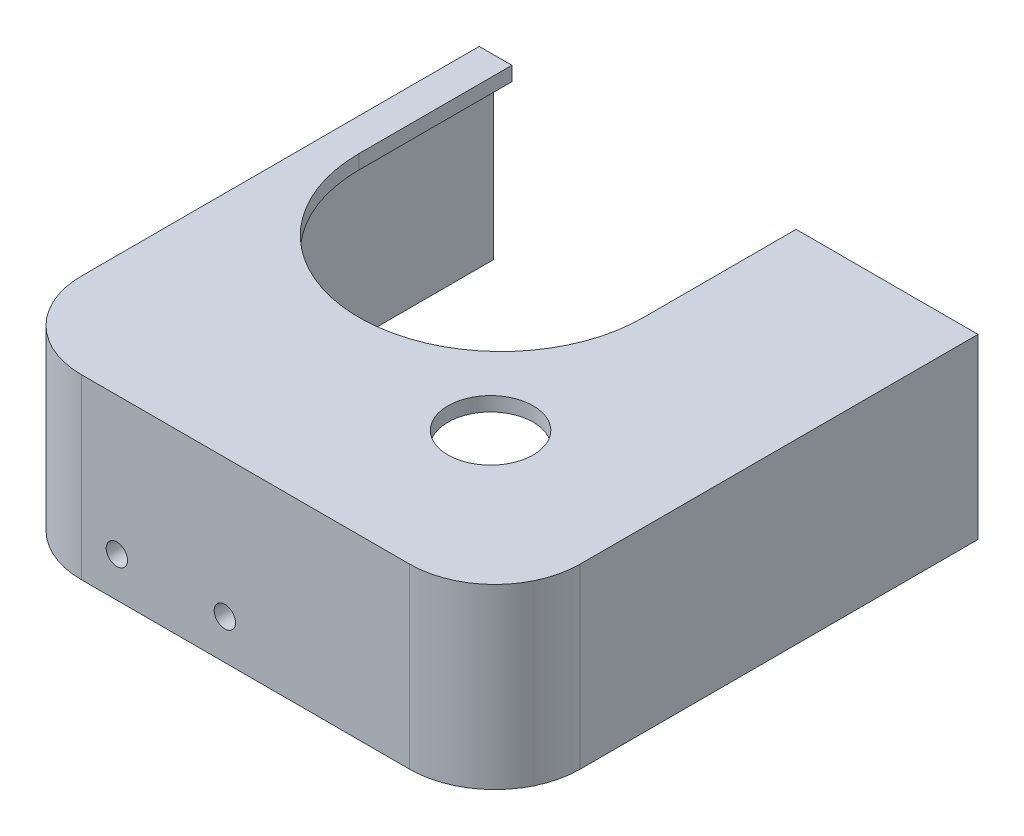
ISO-10303-21;
HEADER;
FILE_DESCRIPTION(('STEP AP214'),'2;1');
FILE_NAME('part.step','',(''),(''),'','','');
FILE_SCHEMA(('AUTOMOTIVE_DESIGN { 1 0 10303 214 1 1 1 1 }'));
ENDSEC;
DATA;
#1=APPLICATION_CONTEXT('core data for automotive mechanical design processes');
#2=APPLICATION_PROTOCOL_DEFINITION('international standard','automotive_design',2000,#1);
#3=PRODUCT_CONTEXT('',#1,'mechanical');
#4=PRODUCT('Part','Part','',(#3));
#5=PRODUCT_RELATED_PRODUCT_CATEGORY('part','',(#4));
#6=PRODUCT_DEFINITION_FORMATION('','',#4);
#7=PRODUCT_DEFINITION_CONTEXT('part definition',#1,'design');
#8=PRODUCT_DEFINITION('design','',#6,#7);
#9=PRODUCT_DEFINITION_SHAPE('','',#8);
#10=(LENGTH_UNIT() NAMED_UNIT(*) SI_UNIT(.MILLI.,.METRE.));
#11=(NAMED_UNIT(*) PLANE_ANGLE_UNIT() SI_UNIT($,.RADIAN.));
#12=(NAMED_UNIT(*) SI_UNIT($,.STERADIAN.) SOLID_ANGLE_UNIT());
#13=UNCERTAINTY_MEASURE_WITH_UNIT(LENGTH_MEASURE(1.E-05),#10,'distance_accuracy_value','');
#14=(GEOMETRIC_REPRESENTATION_CONTEXT(3) GLOBAL_UNCERTAINTY_ASSIGNED_CONTEXT((#13)) GLOBAL_UNIT_ASSIGNED_CONTEXT((#10,
#11,#12)) REPRESENTATION_CONTEXT('',''));
#15=CARTESIAN_POINT('',(0.,0.,0.));
#16=DIRECTION('',(0.,0.,1.));
#17=DIRECTION('',(1.,0.,0.));
#18=AXIS2_PLACEMENT_3D('',#15,#16,#17);
#19=CARTESIAN_POINT('',(-1.5,-13.4999999999995,-21.75));
#20=DIRECTION('',(-1.,0.,0.));
#21=DIRECTION('',(0.,0.,1.));
#22=AXIS2_PLACEMENT_3D('',#19,#20,#21);
#23=PLANE('',#22);
#24=DIRECTION('',(0.,-1.,0.));
#25=VECTOR('',#24,1.);
#26=CARTESIAN_POINT('',(-1.5,-13.4999999999995,-32.5));
#27=LINE('',#26,#25);
#28=CARTESIAN_POINT('',(-1.5,-12.4999999999995,-32.5));
#29=VERTEX_POINT('',#28);
#30=CARTESIAN_POINT('',(-1.5,-13.4999999999995,-32.5));
#31=VERTEX_POINT('',#30);
#32=EDGE_CURVE('E392',#29,#31,#27,.T.);
#33=ORIENTED_EDGE('',*,*,#32,.T.);
#34=DIRECTION('',(0.,0.,-1.));
#35=VECTOR('',#34,1.);
#36=CARTESIAN_POINT('',(-1.5,-13.4999999999995,-21.75));
#37=LINE('',#36,#35);
#38=CARTESIAN_POINT('',(-1.5,-13.4999999999995,-21.75));
#39=VERTEX_POINT('',#38);
#40=EDGE_CURVE('E234',#39,#31,#37,.T.);
#41=ORIENTED_EDGE('',*,*,#40,.F.);
#42=DIRECTION('',(0.,-1.,0.));
#43=VECTOR('',#42,1.);
#44=CARTESIAN_POINT('',(-1.5,-13.4999999999995,-21.75));
#45=LINE('',#44,#43);
#46=CARTESIAN_POINT('',(-1.5,-12.4999999999995,-21.75));
#47=VERTEX_POINT('',#46);
#48=EDGE_CURVE('E395',#47,#39,#45,.T.);
#49=ORIENTED_EDGE('',*,*,#48,.F.);
#50=DIRECTION('',(0.,0.,-1.));
#51=VECTOR('',#50,1.);
#52=CARTESIAN_POINT('',(-1.5,-12.4999999999995,-21.75));
#53=LINE('',#52,#51);
#54=EDGE_CURVE('E298',#47,#29,#53,.T.);
#55=ORIENTED_EDGE('',*,*,#54,.T.);
#56=EDGE_LOOP('',(#33,#41,#49,#55));
#57=FACE_BOUND('',#56,.T.);
#58=ADVANCED_FACE('F38',(#57),#23,.T.);
#59=CARTESIAN_POINT('',(-11.5,-13.4999999999995,-21.75));
#60=DIRECTION('',(0.,-1.,0.));
#61=DIRECTION('',(0.,0.,-1.));
#62=AXIS2_PLACEMENT_3D('',#59,#60,#61);
#63=CYLINDRICAL_SURFACE('',#62,10.);
#64=ORIENTED_EDGE('',*,*,#48,.T.);
#65=CARTESIAN_POINT('',(-11.5,-13.4999999999995,-21.75));
#66=DIRECTION('',(0.,1.,0.));
#67=DIRECTION('',(0.,0.,-1.));
#68=AXIS2_PLACEMENT_3D('',#65,#66,#67);
#69=CIRCLE('',#68,10.);
#70=CARTESIAN_POINT('',(-21.5,-13.4999999999995,-21.75));
#71=VERTEX_POINT('',#70);
#72=EDGE_CURVE('E232',#71,#39,#69,.T.);
#73=ORIENTED_EDGE('',*,*,#72,.F.);
#74=DIRECTION('',(0.,-1.,0.));
#75=VECTOR('',#74,1.);
#76=CARTESIAN_POINT('',(-21.5,-13.4999999999995,-21.75));
#77=LINE('',#76,#75);
#78=CARTESIAN_POINT('',(-21.5,-12.4999999999995,-21.75));
#79=VERTEX_POINT('',#78);
#80=EDGE_CURVE('E398',#79,#71,#77,.T.);
#81=ORIENTED_EDGE('',*,*,#80,.F.);
#82=CARTESIAN_POINT('',(-11.5,-12.4999999999995,-21.75));
#83=DIRECTION('',(0.,1.,0.));
#84=DIRECTION('',(0.,0.,-1.));
#85=AXIS2_PLACEMENT_3D('',#82,#83,#84);
#86=CIRCLE('',#85,10.);
#87=EDGE_CURVE('E295',#79,#47,#86,.T.);
#88=ORIENTED_EDGE('',*,*,#87,.T.);
#89=EDGE_LOOP('',(#64,#73,#81,#88));
#90=FACE_BOUND('',#89,.T.);
#91=ADVANCED_FACE('F433',(#90),#63,.F.);
#92=CARTESIAN_POINT('',(-21.5,-13.4999999999995,-21.75));
#93=DIRECTION('',(1.,0.,0.));
#94=DIRECTION('',(0.,0.,-1.));
#95=AXIS2_PLACEMENT_3D('',#92,#93,#94);
#96=PLANE('',#95);
#97=ORIENTED_EDGE('',*,*,#80,.T.);
#98=DIRECTION('',(0.,0.,1.));
#99=VECTOR('',#98,1.);
#100=CARTESIAN_POINT('',(-21.5,-13.4999999999995,-32.5));
#101=LINE('',#100,#99);
#102=CARTESIAN_POINT('',(-21.5,-13.4999999999995,-32.5));
#103=VERTEX_POINT('',#102);
#104=EDGE_CURVE('E230',#103,#71,#101,.T.);
#105=ORIENTED_EDGE('',*,*,#104,.F.);
#106=DIRECTION('',(0.,-1.,0.));
#107=VECTOR('',#106,1.);
#108=CARTESIAN_POINT('',(-21.5,-13.4999999999995,-32.5));
#109=LINE('',#108,#107);
#110=CARTESIAN_POINT('',(-21.5,-12.4999999999995,-32.5));
#111=VERTEX_POINT('',#110);
#112=EDGE_CURVE('E388',#111,#103,#109,.T.);
#113=ORIENTED_EDGE('',*,*,#112,.F.);
#114=DIRECTION('',(0.,0.,1.));
#115=VECTOR('',#114,1.);
#116=CARTESIAN_POINT('',(-21.5,-12.4999999999995,-21.75));
#117=LINE('',#116,#115);
#118=EDGE_CURVE('E292',#111,#79,#117,.T.);
#119=ORIENTED_EDGE('',*,*,#118,.T.);
#120=EDGE_LOOP('',(#97,#105,#113,#119));
#121=FACE_BOUND('',#120,.T.);
#122=ADVANCED_FACE('F436',(#121),#96,.T.);
#123=CARTESIAN_POINT('',(0.,-15.4999999999995,-9.49999999999997));
#124=DIRECTION('',(0.,1.,0.));
#125=DIRECTION('',(0.,0.,1.));
#126=AXIS2_PLACEMENT_3D('',#123,#124,#125);
#127=CYLINDRICAL_SURFACE('',#126,3.);
#128=CARTESIAN_POINT('',(0.,-12.4999999999995,-9.49999999999997));
#129=DIRECTION('',(0.,-1.,0.));
#130=DIRECTION('',(0.,0.,-1.));
#131=AXIS2_PLACEMENT_3D('',#128,#129,#130);
#132=CIRCLE('',#131,3.);
#133=CARTESIAN_POINT('',(0.,-12.4999999999995,-12.5));
#134=VERTEX_POINT('',#133);
#135=EDGE_CURVE('E256',#134,#134,#132,.T.);
#136=ORIENTED_EDGE('',*,*,#135,.F.);
#137=EDGE_LOOP('',(#136));
#138=FACE_BOUND('',#137,.T.);
#139=CARTESIAN_POINT('',(0.,-13.4999999999995,-9.49999999999997));
#140=DIRECTION('',(0.,-1.,0.));
#141=DIRECTION('',(0.,0.,-1.));
#142=AXIS2_PLACEMENT_3D('',#139,#140,#141);
#143=CIRCLE('',#142,3.);
#144=CARTESIAN_POINT('',(0.,-13.4999999999995,-12.5));
#145=VERTEX_POINT('',#144);
#146=EDGE_CURVE('E42',#145,#145,#143,.F.);
#147=ORIENTED_EDGE('',*,*,#146,.F.);
#148=EDGE_LOOP('',(#147));
#149=FACE_BOUND('',#148,.T.);
#150=ADVANCED_FACE('F508',(#138,#149),#127,.F.);
#151=CARTESIAN_POINT('',(0.,0.,1.5));
#152=DIRECTION('',(0.,0.,1.));
#153=DIRECTION('',(1.,0.,0.));
#154=AXIS2_PLACEMENT_3D('',#151,#152,#153);
#155=PLANE('',#154);
#156=CARTESIAN_POINT('',(-7.7,-22.1999999999995,1.5));
#157=DIRECTION('',(0.,0.,-1.));
#158=DIRECTION('',(1.,0.,0.));
#159=AXIS2_PLACEMENT_3D('',#156,#157,#158);
#160=CIRCLE('',#159,0.749999999999999);
#161=CARTESIAN_POINT('',(-6.95,-22.1999999999995,1.5));
#162=VERTEX_POINT('',#161);
#163=EDGE_CURVE('E331',#162,#162,#160,.T.);
#164=ORIENTED_EDGE('',*,*,#163,.T.);
#165=EDGE_LOOP('',(#164));
#166=FACE_BOUND('',#165,.T.);
#167=CARTESIAN_POINT('',(-15.3,-22.1999999999995,1.5));
#168=DIRECTION('',(0.,0.,-1.));
#169=DIRECTION('',(1.,0.,0.));
#170=AXIS2_PLACEMENT_3D('',#167,#168,#169);
#171=CIRCLE('',#170,0.75);
#172=CARTESIAN_POINT('',(-14.55,-22.1999999999995,1.5));
#173=VERTEX_POINT('',#172);
#174=EDGE_CURVE('E317',#173,#173,#171,.T.);
#175=ORIENTED_EDGE('',*,*,#174,.T.);
#176=EDGE_LOOP('',(#175));
#177=FACE_BOUND('',#176,.T.);
#178=DIRECTION('',(0.,1.,0.));
#179=VECTOR('',#178,1.);
#180=CARTESIAN_POINT('',(5.3,0.,1.5));
#181=LINE('',#180,#179);
#182=CARTESIAN_POINT('',(5.3,-24.9999999999995,1.5));
#183=VERTEX_POINT('',#182);
#184=CARTESIAN_POINT('',(5.3,-12.4999999999995,1.5));
#185=VERTEX_POINT('',#184);
#186=EDGE_CURVE('E47',#183,#185,#181,.T.);
#187=ORIENTED_EDGE('',*,*,#186,.T.);
#188=DIRECTION('',(1.,0.,0.));
#189=VECTOR('',#188,1.);
#190=CARTESIAN_POINT('',(-17.8,-12.4999999999995,1.5));
#191=LINE('',#190,#189);
#192=CARTESIAN_POINT('',(-17.8,-12.4999999999995,1.5));
#193=VERTEX_POINT('',#192);
#194=EDGE_CURVE('E247',#193,#185,#191,.T.);
#195=ORIENTED_EDGE('',*,*,#194,.F.);
#196=DIRECTION('',(0.,1.,0.));
#197=VECTOR('',#196,1.);
#198=CARTESIAN_POINT('',(-17.8,-14.4999999999995,1.5));
#199=LINE('',#198,#197);
#200=CARTESIAN_POINT('',(-17.8,-24.9999999999995,1.5));
#201=VERTEX_POINT('',#200);
#202=EDGE_CURVE('E405',#193,#201,#199,.F.);
#203=ORIENTED_EDGE('',*,*,#202,.T.);
#204=DIRECTION('',(-1.,0.,0.));
#205=VECTOR('',#204,1.);
#206=CARTESIAN_POINT('',(-5.50000000000001,-24.9999999999995,1.5));
#207=LINE('',#206,#205);
#208=EDGE_CURVE('E337',#183,#201,#207,.T.);
#209=ORIENTED_EDGE('',*,*,#208,.F.);
#210=EDGE_LOOP('',(#187,#195,#203,#209));
#211=FACE_BOUND('',#210,.T.);
#212=ADVANCED_FACE('F410',(#166,#177,#211),#155,.T.);
#213=CARTESIAN_POINT('',(11.3,-14.4999999999995,0.5));
#214=DIRECTION('',(1.,0.,0.));
#215=DIRECTION('',(0.,1.,0.));
#216=AXIS2_PLACEMENT_3D('',#213,#214,#215);
#217=PLANE('',#216);
#218=DIRECTION('',(0.,-1.,0.));
#219=VECTOR('',#218,1.);
#220=CARTESIAN_POINT('',(11.3,-13.4999999999995,-32.5));
#221=LINE('',#220,#219);
#222=CARTESIAN_POINT('',(11.3,-12.4999999999995,-32.5));
#223=VERTEX_POINT('',#222);
#224=CARTESIAN_POINT('',(11.3,-24.9999999999995,-32.5));
#225=VERTEX_POINT('',#224);
#226=EDGE_CURVE('E389',#223,#225,#221,.T.);
#227=ORIENTED_EDGE('',*,*,#226,.F.);
#228=DIRECTION('',(0.,0.,-1.));
#229=VECTOR('',#228,1.);
#230=CARTESIAN_POINT('',(11.3,-12.4999999999995,-4.5));
#231=LINE('',#230,#229);
#232=CARTESIAN_POINT('',(11.3,-12.4999999999995,-4.5));
#233=VERTEX_POINT('',#232);
#234=EDGE_CURVE('E251',#233,#223,#231,.T.);
#235=ORIENTED_EDGE('',*,*,#234,.F.);
#236=DIRECTION('',(0.,1.,0.));
#237=VECTOR('',#236,1.);
#238=CARTESIAN_POINT('',(11.3,-14.4999999999995,-4.5));
#239=LINE('',#238,#237);
#240=CARTESIAN_POINT('',(11.3,-24.9999999999995,-4.5));
#241=VERTEX_POINT('',#240);
#242=EDGE_CURVE('E11',#233,#241,#239,.F.);
#243=ORIENTED_EDGE('',*,*,#242,.T.);
#244=DIRECTION('',(0.,0.,1.));
#245=VECTOR('',#244,1.);
#246=CARTESIAN_POINT('',(11.3,-24.9999999999995,0.5));
#247=LINE('',#246,#245);
#248=EDGE_CURVE('E324',#225,#241,#247,.T.);
#249=ORIENTED_EDGE('',*,*,#248,.F.);
#250=EDGE_LOOP('',(#227,#235,#243,#249));
#251=FACE_BOUND('',#250,.T.);
#252=ADVANCED_FACE('F420',(#251),#217,.T.);
#253=CARTESIAN_POINT('',(-1.5,-13.4999999999995,-32.5));
#254=DIRECTION('',(0.,0.,-1.));
#255=DIRECTION('',(-1.,0.,0.));
#256=AXIS2_PLACEMENT_3D('',#253,#254,#255);
#257=PLANE('',#256);
#258=DIRECTION('',(0.,-1.,0.));
#259=VECTOR('',#258,1.);
#260=CARTESIAN_POINT('',(10.3,-24.9999999999995,-32.5));
#261=LINE('',#260,#259);
#262=CARTESIAN_POINT('',(10.3,-13.4999999999995,-32.5));
#263=VERTEX_POINT('',#262);
#264=CARTESIAN_POINT('',(10.3,-24.9999999999995,-32.5));
#265=VERTEX_POINT('',#264);
#266=EDGE_CURVE('E272',#263,#265,#261,.T.);
#267=ORIENTED_EDGE('',*,*,#266,.F.);
#268=DIRECTION('',(1.,0.,0.));
#269=VECTOR('',#268,1.);
#270=CARTESIAN_POINT('',(-1.5,-13.4999999999995,-32.5));
#271=LINE('',#270,#269);
#272=EDGE_CURVE('E236',#31,#263,#271,.T.);
#273=ORIENTED_EDGE('',*,*,#272,.F.);
#274=ORIENTED_EDGE('',*,*,#32,.F.);
#275=DIRECTION('',(1.,0.,0.));
#276=VECTOR('',#275,1.);
#277=CARTESIAN_POINT('',(-1.5,-12.4999999999995,-32.5));
#278=LINE('',#277,#276);
#279=EDGE_CURVE('E301',#29,#223,#278,.T.);
#280=ORIENTED_EDGE('',*,*,#279,.T.);
#281=ORIENTED_EDGE('',*,*,#226,.T.);
#282=DIRECTION('',(1.,0.,0.));
#283=VECTOR('',#282,1.);
#284=CARTESIAN_POINT('',(10.3,-24.9999999999995,-32.5));
#285=LINE('',#284,#283);
#286=EDGE_CURVE('E277',#265,#225,#285,.T.);
#287=ORIENTED_EDGE('',*,*,#286,.F.);
#288=EDGE_LOOP('',(#267,#273,#274,#280,#281,#287));
#289=FACE_BOUND('',#288,.T.);
#290=ADVANCED_FACE('F423',(#289),#257,.T.);
#291=CARTESIAN_POINT('',(-22.8,-13.4999999999995,-32.5));
#292=DIRECTION('',(0.,0.,-1.));
#293=DIRECTION('',(-1.,0.,0.));
#294=AXIS2_PLACEMENT_3D('',#291,#292,#293);
#295=PLANE('',#294);
#296=DIRECTION('',(1.,0.,0.));
#297=VECTOR('',#296,1.);
#298=CARTESIAN_POINT('',(-22.8,-13.4999999999995,-32.5));
#299=LINE('',#298,#297);
#300=CARTESIAN_POINT('',(-22.8,-13.4999999999995,-32.5));
#301=VERTEX_POINT('',#300);
#302=EDGE_CURVE('E220',#301,#103,#299,.T.);
#303=ORIENTED_EDGE('',*,*,#302,.F.);
#304=DIRECTION('',(0.,1.,0.));
#305=VECTOR('',#304,1.);
#306=CARTESIAN_POINT('',(-22.8,-12.4999999999995,-32.5));
#307=LINE('',#306,#305);
#308=CARTESIAN_POINT('',(-22.8,-24.9999999999995,-32.5));
#309=VERTEX_POINT('',#308);
#310=EDGE_CURVE('E217',#309,#301,#307,.T.);
#311=ORIENTED_EDGE('',*,*,#310,.F.);
#312=DIRECTION('',(1.,0.,0.));
#313=VECTOR('',#312,1.);
#314=CARTESIAN_POINT('',(-23.8,-24.9999999999995,-32.5));
#315=LINE('',#314,#313);
#316=CARTESIAN_POINT('',(-23.8,-24.9999999999995,-32.5));
#317=VERTEX_POINT('',#316);
#318=EDGE_CURVE('E284',#317,#309,#315,.T.);
#319=ORIENTED_EDGE('',*,*,#318,.F.);
#320=DIRECTION('',(0.,-1.,0.));
#321=VECTOR('',#320,1.);
#322=CARTESIAN_POINT('',(-23.8,-14.4999999999995,-32.5));
#323=LINE('',#322,#321);
#324=CARTESIAN_POINT('',(-23.8,-12.4999999999995,-32.5));
#325=VERTEX_POINT('',#324);
#326=EDGE_CURVE('E384',#325,#317,#323,.T.);
#327=ORIENTED_EDGE('',*,*,#326,.F.);
#328=DIRECTION('',(1.,0.,0.));
#329=VECTOR('',#328,1.);
#330=CARTESIAN_POINT('',(-22.8,-12.4999999999995,-32.5));
#331=LINE('',#330,#329);
#332=EDGE_CURVE('E289',#325,#111,#331,.T.);
#333=ORIENTED_EDGE('',*,*,#332,.T.);
#334=ORIENTED_EDGE('',*,*,#112,.T.);
#335=EDGE_LOOP('',(#303,#311,#319,#327,#333,#334));
#336=FACE_BOUND('',#335,.T.);
#337=ADVANCED_FACE('F445',(#336),#295,.T.);
#338=CARTESIAN_POINT('',(-23.8,0.,0.));
#339=DIRECTION('',(1.,0.,0.));
#340=DIRECTION('',(0.,0.,-1.));
#341=AXIS2_PLACEMENT_3D('',#338,#339,#340);
#342=PLANE('',#341);
#343=DIRECTION('',(0.,0.,1.));
#344=VECTOR('',#343,1.);
#345=CARTESIAN_POINT('',(-23.8,-12.4999999999995,-32.5));
#346=LINE('',#345,#344);
#347=CARTESIAN_POINT('',(-23.8,-12.4999999999995,-4.5));
#348=VERTEX_POINT('',#347);
#349=EDGE_CURVE('E254',#325,#348,#346,.T.);
#350=ORIENTED_EDGE('',*,*,#349,.F.);
#351=ORIENTED_EDGE('',*,*,#326,.T.);
#352=DIRECTION('',(0.,0.,-1.));
#353=VECTOR('',#352,1.);
#354=CARTESIAN_POINT('',(-23.8,-24.9999999999995,-32.5));
#355=LINE('',#354,#353);
#356=CARTESIAN_POINT('',(-23.8,-24.9999999999995,-4.5));
#357=VERTEX_POINT('',#356);
#358=EDGE_CURVE('E281',#357,#317,#355,.T.);
#359=ORIENTED_EDGE('',*,*,#358,.F.);
#360=DIRECTION('',(0.,1.,0.));
#361=VECTOR('',#360,1.);
#362=CARTESIAN_POINT('',(-23.8,-1.99999999999949,-4.5));
#363=LINE('',#362,#361);
#364=EDGE_CURVE('E391',#357,#348,#363,.T.);
#365=ORIENTED_EDGE('',*,*,#364,.T.);
#366=EDGE_LOOP('',(#350,#351,#359,#365));
#367=FACE_BOUND('',#366,.T.);
#368=ADVANCED_FACE('F442',(#367),#342,.F.);
#369=CARTESIAN_POINT('',(-17.8,0.,-4.5));
#370=DIRECTION('',(0.,-1.,0.));
#371=DIRECTION('',(0.,0.,-1.));
#372=AXIS2_PLACEMENT_3D('',#369,#370,#371);
#373=CYLINDRICAL_SURFACE('',#372,6.);
#374=ORIENTED_EDGE('',*,*,#202,.F.);
#375=CARTESIAN_POINT('',(-17.8,-12.4999999999995,-4.5));
#376=DIRECTION('',(0.,1.,0.));
#377=DIRECTION('',(-1.,0.,0.));
#378=AXIS2_PLACEMENT_3D('',#375,#376,#377);
#379=CIRCLE('',#378,6.);
#380=EDGE_CURVE('E245',#348,#193,#379,.T.);
#381=ORIENTED_EDGE('',*,*,#380,.F.);
#382=ORIENTED_EDGE('',*,*,#364,.F.);
#383=CARTESIAN_POINT('',(-17.8,-24.9999999999995,-4.5));
#384=DIRECTION('',(0.,-1.,0.));
#385=DIRECTION('',(1.,0.,0.));
#386=AXIS2_PLACEMENT_3D('',#383,#384,#385);
#387=CIRCLE('',#386,6.);
#388=EDGE_CURVE('E373',#357,#201,#387,.F.);
#389=ORIENTED_EDGE('',*,*,#388,.T.);
#390=EDGE_LOOP('',(#374,#381,#382,#389));
#391=FACE_BOUND('',#390,.T.);
#392=ADVANCED_FACE('F515',(#391),#373,.T.);
#393=CARTESIAN_POINT('',(5.3,0.,-4.5));
#394=DIRECTION('',(0.,1.,0.));
#395=DIRECTION('',(-1.,0.,0.));
#396=AXIS2_PLACEMENT_3D('',#393,#394,#395);
#397=CYLINDRICAL_SURFACE('',#396,6.);
#398=ORIENTED_EDGE('',*,*,#242,.F.);
#399=CARTESIAN_POINT('',(5.3,-12.4999999999995,-4.5));
#400=DIRECTION('',(0.,1.,0.));
#401=DIRECTION('',(-1.,0.,0.));
#402=AXIS2_PLACEMENT_3D('',#399,#400,#401);
#403=CIRCLE('',#402,6.);
#404=EDGE_CURVE('E249',#185,#233,#403,.T.);
#405=ORIENTED_EDGE('',*,*,#404,.F.);
#406=ORIENTED_EDGE('',*,*,#186,.F.);
#407=CARTESIAN_POINT('',(5.3,-24.9999999999995,-4.5));
#408=DIRECTION('',(0.,-1.,0.));
#409=DIRECTION('',(1.,0.,0.));
#410=AXIS2_PLACEMENT_3D('',#407,#408,#409);
#411=CIRCLE('',#410,6.);
#412=EDGE_CURVE('E382',#183,#241,#411,.F.);
#413=ORIENTED_EDGE('',*,*,#412,.T.);
#414=EDGE_LOOP('',(#398,#405,#406,#413));
#415=FACE_BOUND('',#414,.T.);
#416=ADVANCED_FACE('F40',(#415),#397,.T.);
#417=CARTESIAN_POINT('',(-22.8,-12.4999999999995,0.5));
#418=DIRECTION('',(0.,1.,0.));
#419=DIRECTION('',(0.,0.,-1.));
#420=AXIS2_PLACEMENT_3D('',#417,#418,#419);
#421=PLANE('',#420);
#422=ORIENTED_EDGE('',*,*,#332,.F.);
#423=ORIENTED_EDGE('',*,*,#349,.T.);
#424=ORIENTED_EDGE('',*,*,#380,.T.);
#425=ORIENTED_EDGE('',*,*,#194,.T.);
#426=ORIENTED_EDGE('',*,*,#404,.T.);
#427=ORIENTED_EDGE('',*,*,#234,.T.);
#428=ORIENTED_EDGE('',*,*,#279,.F.);
#429=ORIENTED_EDGE('',*,*,#54,.F.);
#430=ORIENTED_EDGE('',*,*,#87,.F.);
#431=ORIENTED_EDGE('',*,*,#118,.F.);
#432=EDGE_LOOP('',(#422,#423,#424,#425,#426,#427,#428,#429,#430,#431));
#433=FACE_BOUND('',#432,.T.);
#434=ORIENTED_EDGE('',*,*,#135,.T.);
#435=EDGE_LOOP('',(#434));
#436=FACE_BOUND('',#435,.T.);
#437=ADVANCED_FACE('F416',(#433,#436),#421,.T.);
#438=CARTESIAN_POINT('',(0.,-26.999999999999,0.5));
#439=DIRECTION('',(0.,0.,1.));
#440=DIRECTION('',(1.,0.,0.));
#441=AXIS2_PLACEMENT_3D('',#438,#439,#440);
#442=PLANE('',#441);
#443=DIRECTION('',(0.,1.,0.));
#444=VECTOR('',#443,1.);
#445=CARTESIAN_POINT('',(-17.8,-26.999999999999,0.5));
#446=LINE('',#445,#444);
#447=CARTESIAN_POINT('',(-17.8,-13.4999999999995,0.5));
#448=VERTEX_POINT('',#447);
#449=CARTESIAN_POINT('',(-17.8,-24.9999999999995,0.5));
#450=VERTEX_POINT('',#449);
#451=EDGE_CURVE('E211',#448,#450,#446,.F.);
#452=ORIENTED_EDGE('',*,*,#451,.F.);
#453=DIRECTION('',(-1.,0.,0.));
#454=VECTOR('',#453,1.);
#455=CARTESIAN_POINT('',(5.3,-13.4999999999995,0.5));
#456=LINE('',#455,#454);
#457=CARTESIAN_POINT('',(5.3,-13.4999999999995,0.5));
#458=VERTEX_POINT('',#457);
#459=EDGE_CURVE('E226',#458,#448,#456,.T.);
#460=ORIENTED_EDGE('',*,*,#459,.F.);
#461=DIRECTION('',(0.,-1.,0.));
#462=VECTOR('',#461,1.);
#463=CARTESIAN_POINT('',(5.3,-13.4999999999995,0.5));
#464=LINE('',#463,#462);
#465=CARTESIAN_POINT('',(5.3,-24.9999999999995,0.5));
#466=VERTEX_POINT('',#465);
#467=EDGE_CURVE('E378',#466,#458,#464,.F.);
#468=ORIENTED_EDGE('',*,*,#467,.F.);
#469=DIRECTION('',(-1.,0.,0.));
#470=VECTOR('',#469,1.);
#471=CARTESIAN_POINT('',(11.3,-24.9999999999995,0.5));
#472=LINE('',#471,#470);
#473=CARTESIAN_POINT('',(-5.50000000000001,-24.9999999999995,0.5));
#474=VERTEX_POINT('',#473);
#475=EDGE_CURVE('E321',#466,#474,#472,.T.);
#476=ORIENTED_EDGE('',*,*,#475,.T.);
#477=DIRECTION('',(0.,-1.,0.));
#478=VECTOR('',#477,1.);
#479=CARTESIAN_POINT('',(-5.50000000000001,-18.9999999999995,0.5));
#480=LINE('',#479,#478);
#481=CARTESIAN_POINT('',(-5.50000000000001,-16.9999999999995,0.5));
#482=VERTEX_POINT('',#481);
#483=EDGE_CURVE('E327',#482,#474,#480,.T.);
#484=ORIENTED_EDGE('',*,*,#483,.F.);
#485=DIRECTION('',(1.,0.,0.));
#486=VECTOR('',#485,1.);
#487=CARTESIAN_POINT('',(-5.50000000000001,-16.9999999999995,0.5));
#488=LINE('',#487,#486);
#489=CARTESIAN_POINT('',(-17.5,-16.9999999999995,0.5));
#490=VERTEX_POINT('',#489);
#491=EDGE_CURVE('E354',#490,#482,#488,.T.);
#492=ORIENTED_EDGE('',*,*,#491,.F.);
#493=DIRECTION('',(0.,-1.,0.));
#494=VECTOR('',#493,1.);
#495=CARTESIAN_POINT('',(-17.5,-26.999999999999,0.5));
#496=LINE('',#495,#494);
#497=CARTESIAN_POINT('',(-17.5,-24.9999999999995,0.5));
#498=VERTEX_POINT('',#497);
#499=EDGE_CURVE('E351',#490,#498,#496,.T.);
#500=ORIENTED_EDGE('',*,*,#499,.T.);
#501=EDGE_CURVE('E320',#498,#450,#472,.T.);
#502=ORIENTED_EDGE('',*,*,#501,.T.);
#503=EDGE_LOOP('',(#452,#460,#468,#476,#484,#492,#500,#502));
#504=FACE_BOUND('',#503,.T.);
#505=ADVANCED_FACE('F449',(#504),#442,.F.);
#506=CARTESIAN_POINT('',(-5.50000000000001,-18.9999999999995,1.5));
#507=DIRECTION('',(-1.,0.,0.));
#508=DIRECTION('',(0.,0.,1.));
#509=AXIS2_PLACEMENT_3D('',#506,#507,#508);
#510=PLANE('',#509);
#511=ORIENTED_EDGE('',*,*,#483,.T.);
#512=DIRECTION('',(0.,0.,-1.));
#513=VECTOR('',#512,1.);
#514=CARTESIAN_POINT('',(-5.50000000000001,-24.9999999999995,1.5));
#515=LINE('',#514,#513);
#516=CARTESIAN_POINT('',(-5.50000000000001,-24.9999999999995,0.));
#517=VERTEX_POINT('',#516);
#518=EDGE_CURVE('E340',#474,#517,#515,.T.);
#519=ORIENTED_EDGE('',*,*,#518,.T.);
#520=DIRECTION('',(0.,-1.,0.));
#521=VECTOR('',#520,1.);
#522=CARTESIAN_POINT('',(-5.50000000000001,-18.9999999999995,0.));
#523=LINE('',#522,#521);
#524=CARTESIAN_POINT('',(-5.50000000000001,-18.3228756555318,0.));
#525=VERTEX_POINT('',#524);
#526=EDGE_CURVE('E341',#525,#517,#523,.T.);
#527=ORIENTED_EDGE('',*,*,#526,.F.);
#528=CARTESIAN_POINT('',(-5.50000000000001,-16.9999999999995,-1.5));
#529=DIRECTION('',(1.,0.,0.));
#530=DIRECTION('',(0.,0.,1.));
#531=AXIS2_PLACEMENT_3D('',#528,#529,#530);
#532=CIRCLE('',#531,2.);
#533=EDGE_CURVE('E357',#482,#525,#532,.T.);
#534=ORIENTED_EDGE('',*,*,#533,.F.);
#535=EDGE_LOOP('',(#511,#519,#527,#534));
#536=FACE_BOUND('',#535,.T.);
#537=ADVANCED_FACE('F479',(#536),#510,.F.);
#538=CARTESIAN_POINT('',(0.,-26.999999999999,0.));
#539=DIRECTION('',(0.,0.,1.));
#540=DIRECTION('',(1.,0.,0.));
#541=AXIS2_PLACEMENT_3D('',#538,#539,#540);
#542=PLANE('',#541);
#543=DIRECTION('',(-1.,0.,0.));
#544=VECTOR('',#543,1.);
#545=CARTESIAN_POINT('',(-5.50000000000001,-24.9999999999995,0.));
#546=LINE('',#545,#544);
#547=CARTESIAN_POINT('',(-9.89951320303618,-24.9999999999995,0.));
#548=VERTEX_POINT('',#547);
#549=EDGE_CURVE('E334',#517,#548,#546,.T.);
#550=ORIENTED_EDGE('',*,*,#549,.T.);
#551=DIRECTION('',(0.,1.,0.));
#552=VECTOR('',#551,1.);
#553=CARTESIAN_POINT('',(-9.89951320303618,-24.9999999999995,0.));
#554=LINE('',#553,#552);
#555=CARTESIAN_POINT('',(-9.89951320303618,-18.3228756555318,0.));
#556=VERTEX_POINT('',#555);
#557=EDGE_CURVE('E344',#548,#556,#554,.T.);
#558=ORIENTED_EDGE('',*,*,#557,.T.);
#559=DIRECTION('',(-1.,0.,0.));
#560=VECTOR('',#559,1.);
#561=CARTESIAN_POINT('',(-5.50000000000001,-18.3228756555318,0.));
#562=LINE('',#561,#560);
#563=EDGE_CURVE('E360',#525,#556,#562,.T.);
#564=ORIENTED_EDGE('',*,*,#563,.F.);
#565=ORIENTED_EDGE('',*,*,#526,.T.);
#566=EDGE_LOOP('',(#550,#558,#564,#565));
#567=FACE_BOUND('',#566,.T.);
#568=CARTESIAN_POINT('',(-7.7,-22.1999999999995,0.));
#569=DIRECTION('',(0.,0.,-1.));
#570=DIRECTION('',(1.,0.,0.));
#571=AXIS2_PLACEMENT_3D('',#568,#569,#570);
#572=CIRCLE('',#571,0.749999999999999);
#573=CARTESIAN_POINT('',(-6.95,-22.1999999999995,0.));
#574=VERTEX_POINT('',#573);
#575=EDGE_CURVE('E330',#574,#574,#572,.T.);
#576=ORIENTED_EDGE('',*,*,#575,.F.);
#577=EDGE_LOOP('',(#576));
#578=FACE_BOUND('',#577,.T.);
#579=ADVANCED_FACE('F475',(#567,#578),#542,.F.);
#580=CARTESIAN_POINT('',(-5.50000000000001,-24.9999999999995,1.5));
#581=DIRECTION('',(0.,1.,0.));
#582=DIRECTION('',(1.,0.,0.));
#583=AXIS2_PLACEMENT_3D('',#580,#581,#582);
#584=PLANE('',#583);
#585=ORIENTED_EDGE('',*,*,#208,.T.);
#586=ORIENTED_EDGE('',*,*,#388,.F.);
#587=ORIENTED_EDGE('',*,*,#358,.T.);
#588=ORIENTED_EDGE('',*,*,#318,.T.);
#589=DIRECTION('',(0.,0.,-1.));
#590=VECTOR('',#589,1.);
#591=CARTESIAN_POINT('',(-22.8,-24.9999999999995,-32.5));
#592=LINE('',#591,#590);
#593=CARTESIAN_POINT('',(-22.8,-24.9999999999995,-4.5));
#594=VERTEX_POINT('',#593);
#595=EDGE_CURVE('E280',#594,#309,#592,.T.);
#596=ORIENTED_EDGE('',*,*,#595,.F.);
#597=CARTESIAN_POINT('',(-17.8,-24.9999999999995,-4.5));
#598=DIRECTION('',(0.,-1.,0.));
#599=DIRECTION('',(1.,0.,0.));
#600=AXIS2_PLACEMENT_3D('',#597,#598,#599);
#601=CIRCLE('',#600,5.);
#602=EDGE_CURVE('E207',#450,#594,#601,.T.);
#603=ORIENTED_EDGE('',*,*,#602,.F.);
#604=ORIENTED_EDGE('',*,*,#501,.F.);
#605=DIRECTION('',(0.,0.,-1.));
#606=VECTOR('',#605,1.);
#607=CARTESIAN_POINT('',(-17.5,-24.9999999999995,1.5));
#608=LINE('',#607,#606);
#609=CARTESIAN_POINT('',(-17.5,-24.9999999999995,0.));
#610=VERTEX_POINT('',#609);
#611=EDGE_CURVE('E314',#498,#610,#608,.T.);
#612=ORIENTED_EDGE('',*,*,#611,.T.);
#613=DIRECTION('',(-1.,0.,0.));
#614=VECTOR('',#613,1.);
#615=CARTESIAN_POINT('',(-13.1004867969638,-24.9999999999995,0.));
#616=LINE('',#615,#614);
#617=CARTESIAN_POINT('',(-13.1004867969638,-24.9999999999995,0.));
#618=VERTEX_POINT('',#617);
#619=EDGE_CURVE('E306',#618,#610,#616,.T.);
#620=ORIENTED_EDGE('',*,*,#619,.F.);
#621=DIRECTION('',(0.,0.,1.));
#622=VECTOR('',#621,1.);
#623=CARTESIAN_POINT('',(-13.1004867969638,-24.9999999999995,-1.5));
#624=LINE('',#623,#622);
#625=CARTESIAN_POINT('',(-13.1004867969638,-24.9999999999995,-1.5));
#626=VERTEX_POINT('',#625);
#627=EDGE_CURVE('E267',#626,#618,#624,.T.);
#628=ORIENTED_EDGE('',*,*,#627,.F.);
#629=DIRECTION('',(1.,0.,0.));
#630=VECTOR('',#629,1.);
#631=CARTESIAN_POINT('',(-13.1004867969638,-24.9999999999995,-1.5));
#632=LINE('',#631,#630);
#633=CARTESIAN_POINT('',(-9.89951320303618,-24.9999999999995,-1.5));
#634=VERTEX_POINT('',#633);
#635=EDGE_CURVE('E257',#626,#634,#632,.T.);
#636=ORIENTED_EDGE('',*,*,#635,.T.);
#637=DIRECTION('',(0.,0.,1.));
#638=VECTOR('',#637,1.);
#639=CARTESIAN_POINT('',(-9.89951320303618,-24.9999999999995,-1.5));
#640=LINE('',#639,#638);
#641=EDGE_CURVE('E270',#634,#548,#640,.T.);
#642=ORIENTED_EDGE('',*,*,#641,.T.);
#643=ORIENTED_EDGE('',*,*,#549,.F.);
#644=ORIENTED_EDGE('',*,*,#518,.F.);
#645=ORIENTED_EDGE('',*,*,#475,.F.);
#646=CARTESIAN_POINT('',(5.3,-24.9999999999995,-4.5));
#647=DIRECTION('',(0.,-1.,0.));
#648=DIRECTION('',(1.,0.,0.));
#649=AXIS2_PLACEMENT_3D('',#646,#647,#648);
#650=CIRCLE('',#649,5.);
#651=CARTESIAN_POINT('',(10.3,-24.9999999999995,-4.5));
#652=VERTEX_POINT('',#651);
#653=EDGE_CURVE('E380',#652,#466,#650,.T.);
#654=ORIENTED_EDGE('',*,*,#653,.F.);
#655=DIRECTION('',(0.,0.,1.));
#656=VECTOR('',#655,1.);
#657=CARTESIAN_POINT('',(10.3,-24.9999999999995,1.5));
#658=LINE('',#657,#656);
#659=EDGE_CURVE('E274',#265,#652,#658,.T.);
#660=ORIENTED_EDGE('',*,*,#659,.F.);
#661=ORIENTED_EDGE('',*,*,#286,.T.);
#662=ORIENTED_EDGE('',*,*,#248,.T.);
#663=ORIENTED_EDGE('',*,*,#412,.F.);
#664=EDGE_LOOP('',(#585,#586,#587,#588,#596,#603,#604,#612,#620,#628,#636,#642,#643,#644,#645,
#654,#660,#661,#662,#663));
#665=FACE_BOUND('',#664,.T.);
#666=ADVANCED_FACE('F414',(#665),#584,.F.);
#667=CARTESIAN_POINT('',(-7.7,-22.1999999999995,1.5));
#668=DIRECTION('',(0.,0.,-1.));
#669=DIRECTION('',(-1.,0.,0.));
#670=AXIS2_PLACEMENT_3D('',#667,#668,#669);
#671=CYLINDRICAL_SURFACE('',#670,0.749999999999999);
#672=ORIENTED_EDGE('',*,*,#163,.F.);
#673=EDGE_LOOP('',(#672));
#674=FACE_BOUND('',#673,.T.);
#675=ORIENTED_EDGE('',*,*,#575,.T.);
#676=EDGE_LOOP('',(#675));
#677=FACE_BOUND('',#676,.T.);
#678=ADVANCED_FACE('F538',(#674,#677),#671,.F.);
#679=CARTESIAN_POINT('',(-15.3,-22.1999999999995,0.5));
#680=DIRECTION('',(0.,0.,1.));
#681=DIRECTION('',(1.,0.,0.));
#682=AXIS2_PLACEMENT_3D('',#679,#680,#681);
#683=CYLINDRICAL_SURFACE('',#682,0.75);
#684=ORIENTED_EDGE('',*,*,#174,.F.);
#685=EDGE_LOOP('',(#684));
#686=FACE_BOUND('',#685,.T.);
#687=CARTESIAN_POINT('',(-15.3,-22.1999999999995,0.));
#688=DIRECTION('',(0.,0.,-1.));
#689=DIRECTION('',(1.,0.,0.));
#690=AXIS2_PLACEMENT_3D('',#687,#688,#689);
#691=CIRCLE('',#690,0.75);
#692=CARTESIAN_POINT('',(-14.55,-22.1999999999995,0.));
#693=VERTEX_POINT('',#692);
#694=EDGE_CURVE('E303',#693,#693,#691,.T.);
#695=ORIENTED_EDGE('',*,*,#694,.T.);
#696=EDGE_LOOP('',(#695));
#697=FACE_BOUND('',#696,.T.);
#698=ADVANCED_FACE('F545',(#686,#697),#683,.F.);
#699=CARTESIAN_POINT('',(-17.5,-24.9999999999995,1.5));
#700=DIRECTION('',(1.,0.,0.));
#701=DIRECTION('',(0.,0.,-1.));
#702=AXIS2_PLACEMENT_3D('',#699,#700,#701);
#703=PLANE('',#702);
#704=DIRECTION('',(0.,1.,0.));
#705=VECTOR('',#704,1.);
#706=CARTESIAN_POINT('',(-17.5,-24.9999999999995,0.));
#707=LINE('',#706,#705);
#708=CARTESIAN_POINT('',(-17.5,-18.3228756555318,0.));
#709=VERTEX_POINT('',#708);
#710=EDGE_CURVE('E309',#610,#709,#707,.T.);
#711=ORIENTED_EDGE('',*,*,#710,.F.);
#712=ORIENTED_EDGE('',*,*,#611,.F.);
#713=ORIENTED_EDGE('',*,*,#499,.F.);
#714=CARTESIAN_POINT('',(-17.5,-16.9999999999995,-1.5));
#715=DIRECTION('',(-1.,0.,0.));
#716=DIRECTION('',(0.,0.,-1.));
#717=AXIS2_PLACEMENT_3D('',#714,#715,#716);
#718=CIRCLE('',#717,2.);
#719=EDGE_CURVE('E212',#709,#490,#718,.T.);
#720=ORIENTED_EDGE('',*,*,#719,.F.);
#721=EDGE_LOOP('',(#711,#712,#713,#720));
#722=FACE_BOUND('',#721,.T.);
#723=ADVANCED_FACE('F455',(#722),#703,.F.);
#724=CARTESIAN_POINT('',(0.,-26.999999999999,0.));
#725=DIRECTION('',(0.,0.,1.));
#726=DIRECTION('',(1.,0.,0.));
#727=AXIS2_PLACEMENT_3D('',#724,#725,#726);
#728=PLANE('',#727);
#729=ORIENTED_EDGE('',*,*,#619,.T.);
#730=ORIENTED_EDGE('',*,*,#710,.T.);
#731=DIRECTION('',(-1.,0.,0.));
#732=VECTOR('',#731,1.);
#733=CARTESIAN_POINT('',(-13.1004867969638,-18.3228756555318,0.));
#734=LINE('',#733,#732);
#735=CARTESIAN_POINT('',(-13.1004867969638,-18.3228756555318,0.));
#736=VERTEX_POINT('',#735);
#737=EDGE_CURVE('E368',#736,#709,#734,.T.);
#738=ORIENTED_EDGE('',*,*,#737,.F.);
#739=DIRECTION('',(0.,-1.,0.));
#740=VECTOR('',#739,1.);
#741=CARTESIAN_POINT('',(-13.1004867969638,-18.9999999999995,0.));
#742=LINE('',#741,#740);
#743=EDGE_CURVE('E312',#736,#618,#742,.T.);
#744=ORIENTED_EDGE('',*,*,#743,.T.);
#745=EDGE_LOOP('',(#729,#730,#738,#744));
#746=FACE_BOUND('',#745,.T.);
#747=ORIENTED_EDGE('',*,*,#694,.F.);
#748=EDGE_LOOP('',(#747));
#749=FACE_BOUND('',#748,.T.);
#750=ADVANCED_FACE('F459',(#746,#749),#728,.F.);
#751=CARTESIAN_POINT('',(-22.8,-26.999999999999,0.));
#752=DIRECTION('',(1.,0.,0.));
#753=DIRECTION('',(0.,0.,-1.));
#754=AXIS2_PLACEMENT_3D('',#751,#752,#753);
#755=PLANE('',#754);
#756=ORIENTED_EDGE('',*,*,#310,.T.);
#757=DIRECTION('',(0.,0.,-1.));
#758=VECTOR('',#757,1.);
#759=CARTESIAN_POINT('',(-22.8,-13.4999999999995,-4.5));
#760=LINE('',#759,#758);
#761=CARTESIAN_POINT('',(-22.8,-13.4999999999995,-4.5));
#762=VERTEX_POINT('',#761);
#763=EDGE_CURVE('E215',#762,#301,#760,.T.);
#764=ORIENTED_EDGE('',*,*,#763,.F.);
#765=DIRECTION('',(0.,1.,0.));
#766=VECTOR('',#765,1.);
#767=CARTESIAN_POINT('',(-22.8,-26.999999999999,-4.5));
#768=LINE('',#767,#766);
#769=EDGE_CURVE('E200',#594,#762,#768,.T.);
#770=ORIENTED_EDGE('',*,*,#769,.F.);
#771=ORIENTED_EDGE('',*,*,#595,.T.);
#772=EDGE_LOOP('',(#756,#764,#770,#771));
#773=FACE_BOUND('',#772,.T.);
#774=ADVANCED_FACE('F216',(#773),#755,.T.);
#775=CARTESIAN_POINT('',(10.3,-26.999999999999,0.));
#776=DIRECTION('',(1.,0.,0.));
#777=DIRECTION('',(0.,0.,-1.));
#778=AXIS2_PLACEMENT_3D('',#775,#776,#777);
#779=PLANE('',#778);
#780=DIRECTION('',(0.,-1.,0.));
#781=VECTOR('',#780,1.);
#782=CARTESIAN_POINT('',(10.3,-24.9999999999995,-4.5));
#783=LINE('',#782,#781);
#784=CARTESIAN_POINT('',(10.3,-13.4999999999995,-4.5));
#785=VERTEX_POINT('',#784);
#786=EDGE_CURVE('E376',#785,#652,#783,.T.);
#787=ORIENTED_EDGE('',*,*,#786,.F.);
#788=DIRECTION('',(0.,0.,1.));
#789=VECTOR('',#788,1.);
#790=CARTESIAN_POINT('',(10.3,-13.4999999999995,-32.5));
#791=LINE('',#790,#789);
#792=EDGE_CURVE('E239',#263,#785,#791,.T.);
#793=ORIENTED_EDGE('',*,*,#792,.F.);
#794=ORIENTED_EDGE('',*,*,#266,.T.);
#795=ORIENTED_EDGE('',*,*,#659,.T.);
#796=EDGE_LOOP('',(#787,#793,#794,#795));
#797=FACE_BOUND('',#796,.T.);
#798=ADVANCED_FACE('F488',(#797),#779,.F.);
#799=CARTESIAN_POINT('',(-9.89951320303618,-24.9999999999995,-1.5));
#800=DIRECTION('',(-1.,0.,0.));
#801=DIRECTION('',(0.,1.,0.));
#802=AXIS2_PLACEMENT_3D('',#799,#800,#801);
#803=PLANE('',#802);
#804=ORIENTED_EDGE('',*,*,#641,.F.);
#805=DIRECTION('',(0.,1.,0.));
#806=VECTOR('',#805,1.);
#807=CARTESIAN_POINT('',(-9.89951320303618,-24.9999999999995,-1.5));
#808=LINE('',#807,#806);
#809=CARTESIAN_POINT('',(-9.89951320303618,-18.9999999999995,-1.5));
#810=VERTEX_POINT('',#809);
#811=EDGE_CURVE('E260',#634,#810,#808,.T.);
#812=ORIENTED_EDGE('',*,*,#811,.T.);
#813=CARTESIAN_POINT('',(-9.89951320303618,-16.9999999999995,-1.5));
#814=DIRECTION('',(1.,0.,0.));
#815=DIRECTION('',(0.,1.,0.));
#816=AXIS2_PLACEMENT_3D('',#813,#814,#815);
#817=CIRCLE('',#816,2.);
#818=EDGE_CURVE('E363',#556,#810,#817,.T.);
#819=ORIENTED_EDGE('',*,*,#818,.F.);
#820=ORIENTED_EDGE('',*,*,#557,.F.);
#821=EDGE_LOOP('',(#804,#812,#819,#820));
#822=FACE_BOUND('',#821,.T.);
#823=ADVANCED_FACE('F473',(#822),#803,.F.);
#824=CARTESIAN_POINT('',(-13.1004867969638,-18.9999999999995,-1.5));
#825=DIRECTION('',(1.,0.,0.));
#826=DIRECTION('',(0.,-1.,0.));
#827=AXIS2_PLACEMENT_3D('',#824,#825,#826);
#828=PLANE('',#827);
#829=DIRECTION('',(0.,-1.,0.));
#830=VECTOR('',#829,1.);
#831=CARTESIAN_POINT('',(-13.1004867969638,-18.9999999999995,-1.5));
#832=LINE('',#831,#830);
#833=CARTESIAN_POINT('',(-13.1004867969638,-18.9999999999995,-1.5));
#834=VERTEX_POINT('',#833);
#835=EDGE_CURVE('E265',#834,#626,#832,.T.);
#836=ORIENTED_EDGE('',*,*,#835,.T.);
#837=ORIENTED_EDGE('',*,*,#627,.T.);
#838=ORIENTED_EDGE('',*,*,#743,.F.);
#839=CARTESIAN_POINT('',(-13.1004867969638,-16.9999999999995,-1.5));
#840=DIRECTION('',(-1.,0.,0.));
#841=DIRECTION('',(0.,-1.,0.));
#842=AXIS2_PLACEMENT_3D('',#839,#840,#841);
#843=CIRCLE('',#842,2.);
#844=EDGE_CURVE('E366',#834,#736,#843,.T.);
#845=ORIENTED_EDGE('',*,*,#844,.F.);
#846=EDGE_LOOP('',(#836,#837,#838,#845));
#847=FACE_BOUND('',#846,.T.);
#848=ADVANCED_FACE('F465',(#847),#828,.F.);
#849=CARTESIAN_POINT('',(0.,-26.999999999999,-1.5));
#850=DIRECTION('',(0.,0.,-1.));
#851=DIRECTION('',(-1.,0.,0.));
#852=AXIS2_PLACEMENT_3D('',#849,#850,#851);
#853=PLANE('',#852);
#854=ORIENTED_EDGE('',*,*,#635,.F.);
#855=ORIENTED_EDGE('',*,*,#835,.F.);
#856=DIRECTION('',(-1.,0.,0.));
#857=VECTOR('',#856,1.);
#858=CARTESIAN_POINT('',(-9.89951320303618,-18.9999999999995,-1.5));
#859=LINE('',#858,#857);
#860=EDGE_CURVE('E263',#810,#834,#859,.T.);
#861=ORIENTED_EDGE('',*,*,#860,.F.);
#862=ORIENTED_EDGE('',*,*,#811,.F.);
#863=EDGE_LOOP('',(#854,#855,#861,#862));
#864=FACE_BOUND('',#863,.T.);
#865=ADVANCED_FACE('F469',(#864),#853,.T.);
#866=CARTESIAN_POINT('',(0.,-16.9999999999995,-1.5));
#867=DIRECTION('',(-1.,0.,0.));
#868=DIRECTION('',(0.,0.,1.));
#869=AXIS2_PLACEMENT_3D('',#866,#867,#868);
#870=CYLINDRICAL_SURFACE('',#869,2.);
#871=ORIENTED_EDGE('',*,*,#844,.T.);
#872=ORIENTED_EDGE('',*,*,#737,.T.);
#873=ORIENTED_EDGE('',*,*,#719,.T.);
#874=ORIENTED_EDGE('',*,*,#491,.T.);
#875=ORIENTED_EDGE('',*,*,#533,.T.);
#876=ORIENTED_EDGE('',*,*,#563,.T.);
#877=ORIENTED_EDGE('',*,*,#818,.T.);
#878=ORIENTED_EDGE('',*,*,#860,.T.);
#879=EDGE_LOOP('',(#871,#872,#873,#874,#875,#876,#877,#878));
#880=FACE_BOUND('',#879,.T.);
#881=ADVANCED_FACE('F532',(#880),#870,.F.);
#882=CARTESIAN_POINT('',(-17.8,-26.999999999999,-4.5));
#883=DIRECTION('',(0.,1.,0.));
#884=DIRECTION('',(0.,0.,-1.));
#885=AXIS2_PLACEMENT_3D('',#882,#883,#884);
#886=CYLINDRICAL_SURFACE('',#885,5.);
#887=ORIENTED_EDGE('',*,*,#769,.T.);
#888=CARTESIAN_POINT('',(-17.8,-13.4999999999995,-4.5));
#889=DIRECTION('',(0.,-1.,0.));
#890=DIRECTION('',(0.,0.,-1.));
#891=AXIS2_PLACEMENT_3D('',#888,#889,#890);
#892=CIRCLE('',#891,5.);
#893=EDGE_CURVE('E204',#448,#762,#892,.T.);
#894=ORIENTED_EDGE('',*,*,#893,.F.);
#895=ORIENTED_EDGE('',*,*,#451,.T.);
#896=ORIENTED_EDGE('',*,*,#602,.T.);
#897=EDGE_LOOP('',(#887,#894,#895,#896));
#898=FACE_BOUND('',#897,.T.);
#899=ADVANCED_FACE('F202',(#898),#886,.F.);
#900=CARTESIAN_POINT('',(5.3,-26.999999999999,-4.5));
#901=DIRECTION('',(0.,1.,0.));
#902=DIRECTION('',(0.,0.,-1.));
#903=AXIS2_PLACEMENT_3D('',#900,#901,#902);
#904=CYLINDRICAL_SURFACE('',#903,5.);
#905=ORIENTED_EDGE('',*,*,#467,.T.);
#906=CARTESIAN_POINT('',(5.3,-13.4999999999995,-4.5));
#907=DIRECTION('',(0.,-1.,0.));
#908=DIRECTION('',(0.,0.,-1.));
#909=AXIS2_PLACEMENT_3D('',#906,#907,#908);
#910=CIRCLE('',#909,5.);
#911=EDGE_CURVE('E242',#785,#458,#910,.T.);
#912=ORIENTED_EDGE('',*,*,#911,.F.);
#913=ORIENTED_EDGE('',*,*,#786,.T.);
#914=ORIENTED_EDGE('',*,*,#653,.T.);
#915=EDGE_LOOP('',(#905,#912,#913,#914));
#916=FACE_BOUND('',#915,.T.);
#917=ADVANCED_FACE('F485',(#916),#904,.F.);
#918=CARTESIAN_POINT('',(-17.8,-13.4999999999995,-4.5));
#919=DIRECTION('',(0.,-1.,0.));
#920=DIRECTION('',(0.,0.,-1.));
#921=AXIS2_PLACEMENT_3D('',#918,#919,#920);
#922=PLANE('',#921);
#923=ORIENTED_EDGE('',*,*,#893,.T.);
#924=ORIENTED_EDGE('',*,*,#763,.T.);
#925=ORIENTED_EDGE('',*,*,#302,.T.);
#926=ORIENTED_EDGE('',*,*,#104,.T.);
#927=ORIENTED_EDGE('',*,*,#72,.T.);
#928=ORIENTED_EDGE('',*,*,#40,.T.);
#929=ORIENTED_EDGE('',*,*,#272,.T.);
#930=ORIENTED_EDGE('',*,*,#792,.T.);
#931=ORIENTED_EDGE('',*,*,#911,.T.);
#932=ORIENTED_EDGE('',*,*,#459,.T.);
#933=EDGE_LOOP('',(#923,#924,#925,#926,#927,#928,#929,#930,#931,#932));
#934=FACE_BOUND('',#933,.T.);
#935=ORIENTED_EDGE('',*,*,#146,.T.);
#936=EDGE_LOOP('',(#935));
#937=FACE_BOUND('',#936,.T.);
#938=ADVANCED_FACE('F222',(#934,#937),#922,.T.);
#939=CLOSED_SHELL('',(#58,#91,#122,#150,#212,#252,#290,#337,#368,#392,#416,#437,#505,#537,#579,
#666,#678,#698,#723,#750,#774,#798,#823,#848,#865,#881,#899,#917,#938));
#940=MANIFOLD_SOLID_BREP('B2',#939);
#941=ADVANCED_BREP_SHAPE_REPRESENTATION('',(#18,#940),#14);
#942=SHAPE_DEFINITION_REPRESENTATION(#9,#941);
ENDSEC;
END-ISO-10303-21;
